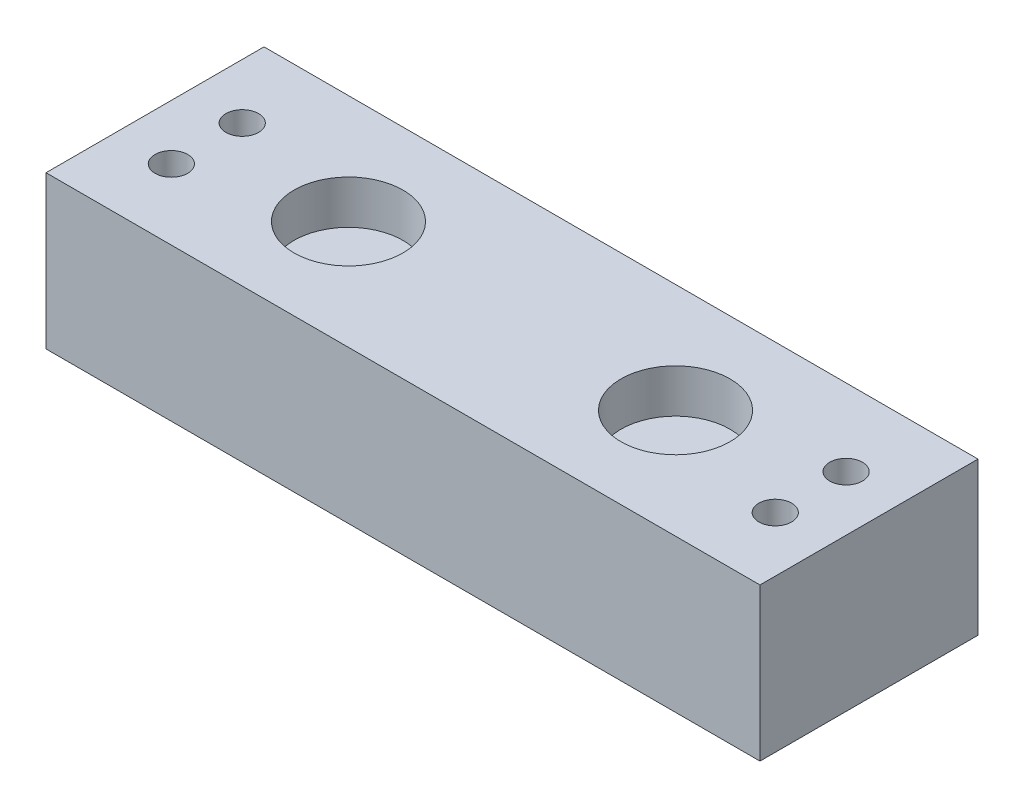
ISO-10303-21;
HEADER;
FILE_DESCRIPTION(('STEP AP214'),'2;1');
FILE_NAME('part.step','',(''),(''),'','','');
FILE_SCHEMA(('AUTOMOTIVE_DESIGN { 1 0 10303 214 1 1 1 1 }'));
ENDSEC;
DATA;
#1=APPLICATION_CONTEXT('core data for automotive mechanical design processes');
#2=APPLICATION_PROTOCOL_DEFINITION('international standard','automotive_design',2000,#1);
#3=PRODUCT_CONTEXT('',#1,'mechanical');
#4=PRODUCT('Part','Part','',(#3));
#5=PRODUCT_RELATED_PRODUCT_CATEGORY('part','',(#4));
#6=PRODUCT_DEFINITION_FORMATION('','',#4);
#7=PRODUCT_DEFINITION_CONTEXT('part definition',#1,'design');
#8=PRODUCT_DEFINITION('design','',#6,#7);
#9=PRODUCT_DEFINITION_SHAPE('','',#8);
#10=(LENGTH_UNIT() NAMED_UNIT(*) SI_UNIT(.MILLI.,.METRE.));
#11=(NAMED_UNIT(*) PLANE_ANGLE_UNIT() SI_UNIT($,.RADIAN.));
#12=(NAMED_UNIT(*) SI_UNIT($,.STERADIAN.) SOLID_ANGLE_UNIT());
#13=UNCERTAINTY_MEASURE_WITH_UNIT(LENGTH_MEASURE(1.E-05),#10,'distance_accuracy_value','');
#14=(GEOMETRIC_REPRESENTATION_CONTEXT(3) GLOBAL_UNCERTAINTY_ASSIGNED_CONTEXT((#13)) GLOBAL_UNIT_ASSIGNED_CONTEXT((#10,
#11,#12)) REPRESENTATION_CONTEXT('',''));
#15=CARTESIAN_POINT('',(0.,0.,0.));
#16=DIRECTION('',(0.,0.,1.));
#17=DIRECTION('',(1.,0.,0.));
#18=AXIS2_PLACEMENT_3D('',#15,#16,#17);
#19=CARTESIAN_POINT('',(0.,0.,20.));
#20=DIRECTION('',(1.,0.,0.));
#21=DIRECTION('',(0.,0.,-1.));
#22=AXIS2_PLACEMENT_3D('',#19,#20,#21);
#23=PLANE('',#22);
#24=DIRECTION('',(0.,-1.,0.));
#25=VECTOR('',#24,1.);
#26=CARTESIAN_POINT('',(0.,0.,0.));
#27=LINE('',#26,#25);
#28=CARTESIAN_POINT('',(0.,14.,0.));
#29=VERTEX_POINT('',#28);
#30=CARTESIAN_POINT('',(0.,0.,0.));
#31=VERTEX_POINT('',#30);
#32=EDGE_CURVE('E99',#29,#31,#27,.T.);
#33=ORIENTED_EDGE('',*,*,#32,.T.);
#34=DIRECTION('',(0.,0.,-1.));
#35=VECTOR('',#34,1.);
#36=CARTESIAN_POINT('',(0.,0.,20.));
#37=LINE('',#36,#35);
#38=CARTESIAN_POINT('',(0.,0.,20.));
#39=VERTEX_POINT('',#38);
#40=EDGE_CURVE('E11',#39,#31,#37,.T.);
#41=ORIENTED_EDGE('',*,*,#40,.F.);
#42=DIRECTION('',(0.,-1.,0.));
#43=VECTOR('',#42,1.);
#44=CARTESIAN_POINT('',(0.,0.,20.));
#45=LINE('',#44,#43);
#46=CARTESIAN_POINT('',(0.,14.,20.));
#47=VERTEX_POINT('',#46);
#48=EDGE_CURVE('E84',#47,#39,#45,.T.);
#49=ORIENTED_EDGE('',*,*,#48,.F.);
#50=DIRECTION('',(0.,0.,-1.));
#51=VECTOR('',#50,1.);
#52=CARTESIAN_POINT('',(0.,14.,20.));
#53=LINE('',#52,#51);
#54=EDGE_CURVE('E95',#47,#29,#53,.T.);
#55=ORIENTED_EDGE('',*,*,#54,.T.);
#56=EDGE_LOOP('',(#33,#41,#49,#55));
#57=FACE_BOUND('',#56,.T.);
#58=ADVANCED_FACE('F32',(#57),#23,.F.);
#59=CARTESIAN_POINT('',(0.,0.,20.));
#60=DIRECTION('',(0.,1.,0.));
#61=DIRECTION('',(0.,0.,1.));
#62=AXIS2_PLACEMENT_3D('',#59,#60,#61);
#63=PLANE('',#62);
#64=CARTESIAN_POINT('',(5.05,0.,13.5500000000001));
#65=DIRECTION('',(0.,-1.,0.));
#66=DIRECTION('',(0.,0.,-1.));
#67=AXIS2_PLACEMENT_3D('',#64,#65,#66);
#68=CIRCLE('',#67,1.5);
#69=CARTESIAN_POINT('',(5.05,0.,12.0500000000001));
#70=VERTEX_POINT('',#69);
#71=EDGE_CURVE('E151',#70,#70,#68,.T.);
#72=ORIENTED_EDGE('',*,*,#71,.F.);
#73=EDGE_LOOP('',(#72));
#74=FACE_BOUND('',#73,.T.);
#75=CARTESIAN_POINT('',(60.45,0.,7.04999999999954));
#76=DIRECTION('',(0.,-1.,0.));
#77=DIRECTION('',(0.,0.,-1.));
#78=AXIS2_PLACEMENT_3D('',#75,#76,#77);
#79=CIRCLE('',#78,1.5);
#80=CARTESIAN_POINT('',(60.45,0.,5.54999999999954));
#81=VERTEX_POINT('',#80);
#82=EDGE_CURVE('E152',#81,#81,#79,.T.);
#83=ORIENTED_EDGE('',*,*,#82,.F.);
#84=EDGE_LOOP('',(#83));
#85=FACE_BOUND('',#84,.T.);
#86=CARTESIAN_POINT('',(60.45,0.,13.5499999999995));
#87=DIRECTION('',(0.,-1.,0.));
#88=DIRECTION('',(0.,0.,-1.));
#89=AXIS2_PLACEMENT_3D('',#86,#87,#88);
#90=CIRCLE('',#89,1.5);
#91=CARTESIAN_POINT('',(60.45,0.,12.0499999999995));
#92=VERTEX_POINT('',#91);
#93=EDGE_CURVE('E155',#92,#92,#90,.T.);
#94=ORIENTED_EDGE('',*,*,#93,.F.);
#95=EDGE_LOOP('',(#94));
#96=FACE_BOUND('',#95,.T.);
#97=CARTESIAN_POINT('',(5.05,0.,7.05000000000012));
#98=DIRECTION('',(0.,-1.,0.));
#99=DIRECTION('',(0.,0.,-1.));
#100=AXIS2_PLACEMENT_3D('',#97,#98,#99);
#101=CIRCLE('',#100,1.5);
#102=CARTESIAN_POINT('',(5.05,0.,5.55000000000012));
#103=VERTEX_POINT('',#102);
#104=EDGE_CURVE('E112',#103,#103,#101,.T.);
#105=ORIENTED_EDGE('',*,*,#104,.F.);
#106=EDGE_LOOP('',(#105));
#107=FACE_BOUND('',#106,.T.);
#108=DIRECTION('',(1.,0.,0.));
#109=VECTOR('',#108,1.);
#110=CARTESIAN_POINT('',(0.,0.,0.));
#111=LINE('',#110,#109);
#112=CARTESIAN_POINT('',(65.5,0.,0.));
#113=VERTEX_POINT('',#112);
#114=EDGE_CURVE('E89',#31,#113,#111,.T.);
#115=ORIENTED_EDGE('',*,*,#114,.T.);
#116=DIRECTION('',(0.,0.,-1.));
#117=VECTOR('',#116,1.);
#118=CARTESIAN_POINT('',(65.5,0.,20.));
#119=LINE('',#118,#117);
#120=CARTESIAN_POINT('',(65.5,0.,20.));
#121=VERTEX_POINT('',#120);
#122=EDGE_CURVE('E41',#121,#113,#119,.T.);
#123=ORIENTED_EDGE('',*,*,#122,.F.);
#124=DIRECTION('',(1.,0.,0.));
#125=VECTOR('',#124,1.);
#126=CARTESIAN_POINT('',(0.,0.,20.));
#127=LINE('',#126,#125);
#128=EDGE_CURVE('E78',#39,#121,#127,.T.);
#129=ORIENTED_EDGE('',*,*,#128,.F.);
#130=ORIENTED_EDGE('',*,*,#40,.T.);
#131=EDGE_LOOP('',(#115,#123,#129,#130));
#132=FACE_BOUND('',#131,.T.);
#133=ADVANCED_FACE('F88',(#74,#85,#96,#107,#132),#63,.F.);
#134=CARTESIAN_POINT('',(65.5,0.,20.));
#135=DIRECTION('',(-1.,0.,0.));
#136=DIRECTION('',(0.,0.,1.));
#137=AXIS2_PLACEMENT_3D('',#134,#135,#136);
#138=PLANE('',#137);
#139=DIRECTION('',(0.,1.,0.));
#140=VECTOR('',#139,1.);
#141=CARTESIAN_POINT('',(65.5,0.,0.));
#142=LINE('',#141,#140);
#143=CARTESIAN_POINT('',(65.5,14.,0.));
#144=VERTEX_POINT('',#143);
#145=EDGE_CURVE('E103',#113,#144,#142,.T.);
#146=ORIENTED_EDGE('',*,*,#145,.T.);
#147=DIRECTION('',(0.,0.,-1.));
#148=VECTOR('',#147,1.);
#149=CARTESIAN_POINT('',(65.5,14.,20.));
#150=LINE('',#149,#148);
#151=CARTESIAN_POINT('',(65.5,14.,20.));
#152=VERTEX_POINT('',#151);
#153=EDGE_CURVE('E91',#152,#144,#150,.T.);
#154=ORIENTED_EDGE('',*,*,#153,.F.);
#155=DIRECTION('',(0.,1.,0.));
#156=VECTOR('',#155,1.);
#157=CARTESIAN_POINT('',(65.5,0.,20.));
#158=LINE('',#157,#156);
#159=EDGE_CURVE('E81',#121,#152,#158,.T.);
#160=ORIENTED_EDGE('',*,*,#159,.F.);
#161=ORIENTED_EDGE('',*,*,#122,.T.);
#162=EDGE_LOOP('',(#146,#154,#160,#161));
#163=FACE_BOUND('',#162,.T.);
#164=ADVANCED_FACE('F93',(#163),#138,.F.);
#165=CARTESIAN_POINT('',(0.,14.,20.));
#166=DIRECTION('',(0.,-1.,0.));
#167=DIRECTION('',(0.,0.,-1.));
#168=AXIS2_PLACEMENT_3D('',#165,#166,#167);
#169=PLANE('',#168);
#170=CARTESIAN_POINT('',(17.75,14.,10.));
#171=DIRECTION('',(0.,1.,0.));
#172=DIRECTION('',(0.,0.,1.));
#173=AXIS2_PLACEMENT_3D('',#170,#171,#172);
#174=CIRCLE('',#173,5.);
#175=CARTESIAN_POINT('',(17.75,14.,15.));
#176=VERTEX_POINT('',#175);
#177=EDGE_CURVE('E166',#176,#176,#174,.T.);
#178=ORIENTED_EDGE('',*,*,#177,.F.);
#179=EDGE_LOOP('',(#178));
#180=FACE_BOUND('',#179,.T.);
#181=CARTESIAN_POINT('',(47.75,14.,10.));
#182=DIRECTION('',(0.,1.,0.));
#183=DIRECTION('',(0.,0.,-1.));
#184=AXIS2_PLACEMENT_3D('',#181,#182,#183);
#185=CIRCLE('',#184,5.);
#186=CARTESIAN_POINT('',(47.75,14.,5.));
#187=VERTEX_POINT('',#186);
#188=EDGE_CURVE('E160',#187,#187,#185,.T.);
#189=ORIENTED_EDGE('',*,*,#188,.F.);
#190=EDGE_LOOP('',(#189));
#191=FACE_BOUND('',#190,.T.);
#192=CARTESIAN_POINT('',(5.05,14.,13.5500000000001));
#193=DIRECTION('',(0.,-1.,0.));
#194=DIRECTION('',(0.,0.,-1.));
#195=AXIS2_PLACEMENT_3D('',#192,#193,#194);
#196=CIRCLE('',#195,1.5);
#197=CARTESIAN_POINT('',(5.05,14.,12.0500000000001));
#198=VERTEX_POINT('',#197);
#199=EDGE_CURVE('E35',#198,#198,#196,.T.);
#200=ORIENTED_EDGE('',*,*,#199,.T.);
#201=EDGE_LOOP('',(#200));
#202=FACE_BOUND('',#201,.T.);
#203=CARTESIAN_POINT('',(60.45,14.,7.04999999999954));
#204=DIRECTION('',(0.,-1.,0.));
#205=DIRECTION('',(0.,0.,-1.));
#206=AXIS2_PLACEMENT_3D('',#203,#204,#205);
#207=CIRCLE('',#206,1.5);
#208=CARTESIAN_POINT('',(60.45,14.,5.54999999999954));
#209=VERTEX_POINT('',#208);
#210=EDGE_CURVE('E114',#209,#209,#207,.T.);
#211=ORIENTED_EDGE('',*,*,#210,.T.);
#212=EDGE_LOOP('',(#211));
#213=FACE_BOUND('',#212,.T.);
#214=CARTESIAN_POINT('',(60.45,14.,13.5499999999995));
#215=DIRECTION('',(0.,-1.,0.));
#216=DIRECTION('',(0.,0.,-1.));
#217=AXIS2_PLACEMENT_3D('',#214,#215,#216);
#218=CIRCLE('',#217,1.5);
#219=CARTESIAN_POINT('',(60.45,14.,12.0499999999995));
#220=VERTEX_POINT('',#219);
#221=EDGE_CURVE('E111',#220,#220,#218,.T.);
#222=ORIENTED_EDGE('',*,*,#221,.T.);
#223=EDGE_LOOP('',(#222));
#224=FACE_BOUND('',#223,.T.);
#225=CARTESIAN_POINT('',(5.05,14.,7.05000000000012));
#226=DIRECTION('',(0.,-1.,0.));
#227=DIRECTION('',(0.,0.,-1.));
#228=AXIS2_PLACEMENT_3D('',#225,#226,#227);
#229=CIRCLE('',#228,1.5);
#230=CARTESIAN_POINT('',(5.05,14.,5.55000000000012));
#231=VERTEX_POINT('',#230);
#232=EDGE_CURVE('E108',#231,#231,#229,.T.);
#233=ORIENTED_EDGE('',*,*,#232,.T.);
#234=EDGE_LOOP('',(#233));
#235=FACE_BOUND('',#234,.T.);
#236=DIRECTION('',(-1.,0.,0.));
#237=VECTOR('',#236,1.);
#238=CARTESIAN_POINT('',(0.,14.,0.));
#239=LINE('',#238,#237);
#240=EDGE_CURVE('E67',#144,#29,#239,.T.);
#241=ORIENTED_EDGE('',*,*,#240,.T.);
#242=ORIENTED_EDGE('',*,*,#54,.F.);
#243=DIRECTION('',(-1.,0.,0.));
#244=VECTOR('',#243,1.);
#245=CARTESIAN_POINT('',(38.75,14.,20.));
#246=LINE('',#245,#244);
#247=EDGE_CURVE('E50',#152,#47,#246,.T.);
#248=ORIENTED_EDGE('',*,*,#247,.F.);
#249=ORIENTED_EDGE('',*,*,#153,.T.);
#250=EDGE_LOOP('',(#241,#242,#248,#249));
#251=FACE_BOUND('',#250,.T.);
#252=ADVANCED_FACE('F121',(#180,#191,#202,#213,#224,#235,#251),#169,.F.);
#253=CARTESIAN_POINT('',(0.,0.,20.));
#254=DIRECTION('',(0.,0.,-1.));
#255=DIRECTION('',(-1.,0.,0.));
#256=AXIS2_PLACEMENT_3D('',#253,#254,#255);
#257=PLANE('',#256);
#258=ORIENTED_EDGE('',*,*,#48,.T.);
#259=ORIENTED_EDGE('',*,*,#128,.T.);
#260=ORIENTED_EDGE('',*,*,#159,.T.);
#261=ORIENTED_EDGE('',*,*,#247,.T.);
#262=EDGE_LOOP('',(#258,#259,#260,#261));
#263=FACE_BOUND('',#262,.T.);
#264=ADVANCED_FACE('F79',(#263),#257,.F.);
#265=CARTESIAN_POINT('',(0.,0.,0.));
#266=DIRECTION('',(0.,0.,-1.));
#267=DIRECTION('',(-1.,0.,0.));
#268=AXIS2_PLACEMENT_3D('',#265,#266,#267);
#269=PLANE('',#268);
#270=ORIENTED_EDGE('',*,*,#32,.F.);
#271=ORIENTED_EDGE('',*,*,#240,.F.);
#272=ORIENTED_EDGE('',*,*,#145,.F.);
#273=ORIENTED_EDGE('',*,*,#114,.F.);
#274=EDGE_LOOP('',(#270,#271,#272,#273));
#275=FACE_BOUND('',#274,.T.);
#276=ADVANCED_FACE('F147',(#275),#269,.T.);
#277=CARTESIAN_POINT('',(5.05,54.,7.05000000000012));
#278=DIRECTION('',(0.,-1.,0.));
#279=DIRECTION('',(0.,0.,-1.));
#280=AXIS2_PLACEMENT_3D('',#277,#278,#279);
#281=CYLINDRICAL_SURFACE('',#280,1.5);
#282=ORIENTED_EDGE('',*,*,#104,.T.);
#283=EDGE_LOOP('',(#282));
#284=FACE_BOUND('',#283,.T.);
#285=ORIENTED_EDGE('',*,*,#232,.F.);
#286=EDGE_LOOP('',(#285));
#287=FACE_BOUND('',#286,.T.);
#288=ADVANCED_FACE('F193',(#284,#287),#281,.F.);
#289=CARTESIAN_POINT('',(60.45,54.,13.5499999999995));
#290=DIRECTION('',(0.,-1.,0.));
#291=DIRECTION('',(0.,0.,-1.));
#292=AXIS2_PLACEMENT_3D('',#289,#290,#291);
#293=CYLINDRICAL_SURFACE('',#292,1.5);
#294=ORIENTED_EDGE('',*,*,#93,.T.);
#295=EDGE_LOOP('',(#294));
#296=FACE_BOUND('',#295,.T.);
#297=ORIENTED_EDGE('',*,*,#221,.F.);
#298=EDGE_LOOP('',(#297));
#299=FACE_BOUND('',#298,.T.);
#300=ADVANCED_FACE('F136',(#296,#299),#293,.F.);
#301=CARTESIAN_POINT('',(60.45,54.,7.04999999999954));
#302=DIRECTION('',(0.,-1.,0.));
#303=DIRECTION('',(0.,0.,-1.));
#304=AXIS2_PLACEMENT_3D('',#301,#302,#303);
#305=CYLINDRICAL_SURFACE('',#304,1.5);
#306=ORIENTED_EDGE('',*,*,#82,.T.);
#307=EDGE_LOOP('',(#306));
#308=FACE_BOUND('',#307,.T.);
#309=ORIENTED_EDGE('',*,*,#210,.F.);
#310=EDGE_LOOP('',(#309));
#311=FACE_BOUND('',#310,.T.);
#312=ADVANCED_FACE('F126',(#308,#311),#305,.F.);
#313=CARTESIAN_POINT('',(5.05,54.,13.5500000000001));
#314=DIRECTION('',(0.,-1.,0.));
#315=DIRECTION('',(0.,0.,-1.));
#316=AXIS2_PLACEMENT_3D('',#313,#314,#315);
#317=CYLINDRICAL_SURFACE('',#316,1.5);
#318=ORIENTED_EDGE('',*,*,#71,.T.);
#319=EDGE_LOOP('',(#318));
#320=FACE_BOUND('',#319,.T.);
#321=ORIENTED_EDGE('',*,*,#199,.F.);
#322=EDGE_LOOP('',(#321));
#323=FACE_BOUND('',#322,.T.);
#324=ADVANCED_FACE('F123',(#320,#323),#317,.F.);
#325=CARTESIAN_POINT('',(47.75,10.,10.));
#326=DIRECTION('',(0.,1.,0.));
#327=DIRECTION('',(0.,0.,1.));
#328=AXIS2_PLACEMENT_3D('',#325,#326,#327);
#329=CYLINDRICAL_SURFACE('',#328,5.);
#330=CARTESIAN_POINT('',(47.75,10.,10.));
#331=DIRECTION('',(0.,1.,0.));
#332=DIRECTION('',(0.,0.,-1.));
#333=AXIS2_PLACEMENT_3D('',#330,#331,#332);
#334=CIRCLE('',#333,5.);
#335=CARTESIAN_POINT('',(47.75,10.,5.));
#336=VERTEX_POINT('',#335);
#337=EDGE_CURVE('E163',#336,#336,#334,.T.);
#338=ORIENTED_EDGE('',*,*,#337,.F.);
#339=EDGE_LOOP('',(#338));
#340=FACE_BOUND('',#339,.T.);
#341=ORIENTED_EDGE('',*,*,#188,.T.);
#342=EDGE_LOOP('',(#341));
#343=FACE_BOUND('',#342,.T.);
#344=ADVANCED_FACE('F125',(#340,#343),#329,.F.);
#345=CARTESIAN_POINT('',(47.75,10.,10.));
#346=DIRECTION('',(0.,-1.,0.));
#347=DIRECTION('',(0.,0.,-1.));
#348=AXIS2_PLACEMENT_3D('',#345,#346,#347);
#349=PLANE('',#348);
#350=ORIENTED_EDGE('',*,*,#337,.T.);
#351=EDGE_LOOP('',(#350));
#352=FACE_BOUND('',#351,.T.);
#353=ADVANCED_FACE('F133',(#352),#349,.F.);
#354=CARTESIAN_POINT('',(17.75,10.,10.));
#355=DIRECTION('',(0.,1.,0.));
#356=DIRECTION('',(0.,0.,1.));
#357=AXIS2_PLACEMENT_3D('',#354,#355,#356);
#358=CYLINDRICAL_SURFACE('',#357,5.);
#359=CARTESIAN_POINT('',(17.75,10.,10.));
#360=DIRECTION('',(0.,1.,0.));
#361=DIRECTION('',(0.,0.,1.));
#362=AXIS2_PLACEMENT_3D('',#359,#360,#361);
#363=CIRCLE('',#362,5.);
#364=CARTESIAN_POINT('',(17.75,10.,15.));
#365=VERTEX_POINT('',#364);
#366=EDGE_CURVE('E159',#365,#365,#363,.T.);
#367=ORIENTED_EDGE('',*,*,#366,.F.);
#368=EDGE_LOOP('',(#367));
#369=FACE_BOUND('',#368,.T.);
#370=ORIENTED_EDGE('',*,*,#177,.T.);
#371=EDGE_LOOP('',(#370));
#372=FACE_BOUND('',#371,.T.);
#373=ADVANCED_FACE('F174',(#369,#372),#358,.F.);
#374=CARTESIAN_POINT('',(17.75,10.,10.));
#375=DIRECTION('',(0.,1.,0.));
#376=DIRECTION('',(0.,0.,1.));
#377=AXIS2_PLACEMENT_3D('',#374,#375,#376);
#378=PLANE('',#377);
#379=ORIENTED_EDGE('',*,*,#366,.T.);
#380=EDGE_LOOP('',(#379));
#381=FACE_BOUND('',#380,.T.);
#382=ADVANCED_FACE('F172',(#381),#378,.T.);
#383=CLOSED_SHELL('',(#58,#133,#164,#252,#264,#276,#288,#300,#312,#324,#344,#353,#373,#382));
#384=MANIFOLD_SOLID_BREP('B2',#383);
#385=ADVANCED_BREP_SHAPE_REPRESENTATION('',(#18,#384),#14);
#386=SHAPE_DEFINITION_REPRESENTATION(#9,#385);
ENDSEC;
END-ISO-10303-21;
